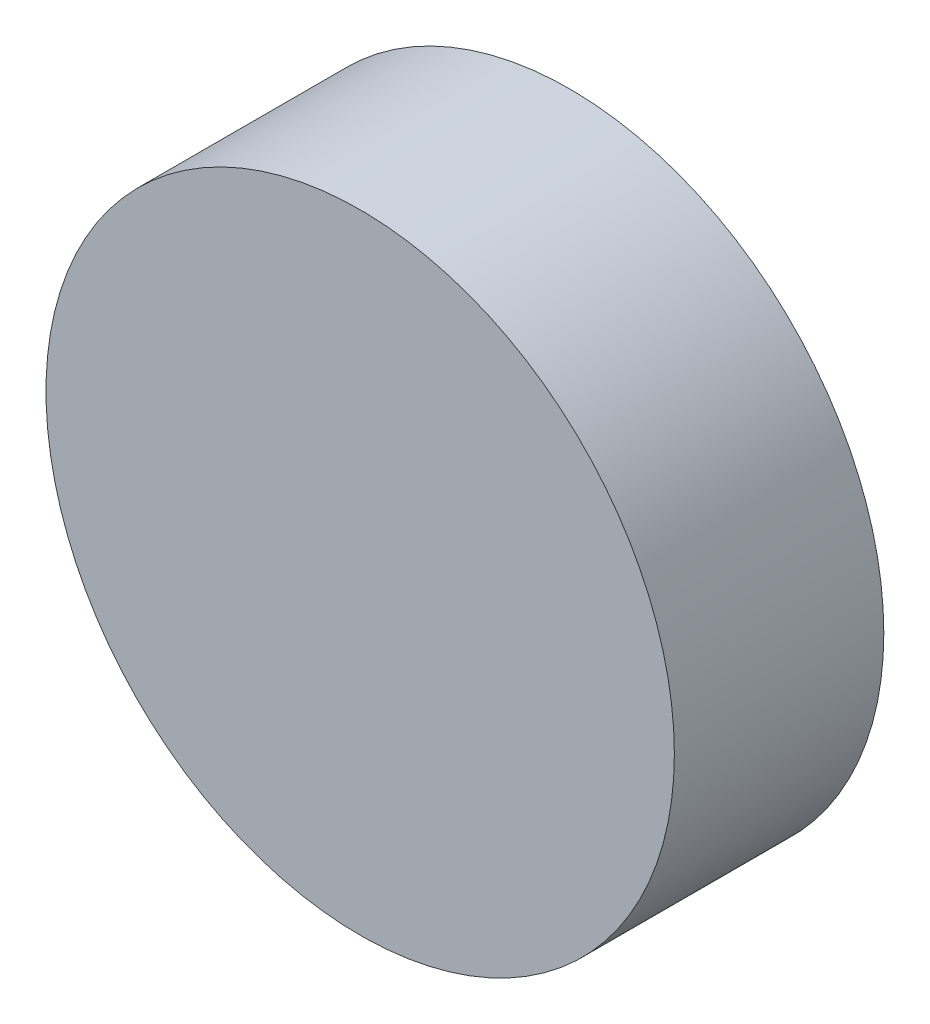
ISO-10303-21;
HEADER;
FILE_DESCRIPTION(('STEP AP214'),'2;1');
FILE_NAME('part.step','',(''),(''),'','','');
FILE_SCHEMA(('AUTOMOTIVE_DESIGN { 1 0 10303 214 1 1 1 1 }'));
ENDSEC;
DATA;
#1=APPLICATION_CONTEXT('core data for automotive mechanical design processes');
#2=APPLICATION_PROTOCOL_DEFINITION('international standard','automotive_design',2000,#1);
#3=PRODUCT_CONTEXT('',#1,'mechanical');
#4=PRODUCT('Part','Part','',(#3));
#5=PRODUCT_RELATED_PRODUCT_CATEGORY('part','',(#4));
#6=PRODUCT_DEFINITION_FORMATION('','',#4);
#7=PRODUCT_DEFINITION_CONTEXT('part definition',#1,'design');
#8=PRODUCT_DEFINITION('design','',#6,#7);
#9=PRODUCT_DEFINITION_SHAPE('','',#8);
#10=(LENGTH_UNIT() NAMED_UNIT(*) SI_UNIT(.MILLI.,.METRE.));
#11=(NAMED_UNIT(*) PLANE_ANGLE_UNIT() SI_UNIT($,.RADIAN.));
#12=(NAMED_UNIT(*) SI_UNIT($,.STERADIAN.) SOLID_ANGLE_UNIT());
#13=UNCERTAINTY_MEASURE_WITH_UNIT(LENGTH_MEASURE(1.E-05),#10,'distance_accuracy_value','');
#14=(GEOMETRIC_REPRESENTATION_CONTEXT(3) GLOBAL_UNCERTAINTY_ASSIGNED_CONTEXT((#13)) GLOBAL_UNIT_ASSIGNED_CONTEXT((#10,
#11,#12)) REPRESENTATION_CONTEXT('',''));
#15=CARTESIAN_POINT('',(0.,0.,0.));
#16=DIRECTION('',(0.,0.,1.));
#17=DIRECTION('',(1.,0.,0.));
#18=AXIS2_PLACEMENT_3D('',#15,#16,#17);
#19=CARTESIAN_POINT('',(0.,0.,2.));
#20=DIRECTION('',(0.,0.,-1.));
#21=DIRECTION('',(-1.,0.,0.));
#22=AXIS2_PLACEMENT_3D('',#19,#20,#21);
#23=CYLINDRICAL_SURFACE('',#22,3.);
#24=CARTESIAN_POINT('',(0.,0.,2.));
#25=DIRECTION('',(0.,0.,1.));
#26=DIRECTION('',(1.,0.,0.));
#27=AXIS2_PLACEMENT_3D('',#24,#25,#26);
#28=CIRCLE('',#27,3.);
#29=CARTESIAN_POINT('',(3.,0.,2.));
#30=VERTEX_POINT('',#29);
#31=EDGE_CURVE('E10',#30,#30,#28,.T.);
#32=ORIENTED_EDGE('',*,*,#31,.F.);
#33=EDGE_LOOP('',(#32));
#34=FACE_BOUND('',#33,.T.);
#35=CARTESIAN_POINT('',(0.,0.,0.));
#36=DIRECTION('',(0.,0.,1.));
#37=DIRECTION('',(1.,0.,0.));
#38=AXIS2_PLACEMENT_3D('',#35,#36,#37);
#39=CIRCLE('',#38,3.);
#40=CARTESIAN_POINT('',(3.,0.,0.));
#41=VERTEX_POINT('',#40);
#42=EDGE_CURVE('E34',#41,#41,#39,.T.);
#43=ORIENTED_EDGE('',*,*,#42,.T.);
#44=EDGE_LOOP('',(#43));
#45=FACE_BOUND('',#44,.T.);
#46=ADVANCED_FACE('F31',(#34,#45),#23,.T.);
#47=CARTESIAN_POINT('',(0.,0.,2.));
#48=DIRECTION('',(0.,0.,1.));
#49=DIRECTION('',(1.,0.,0.));
#50=AXIS2_PLACEMENT_3D('',#47,#48,#49);
#51=PLANE('',#50);
#52=ORIENTED_EDGE('',*,*,#31,.T.);
#53=EDGE_LOOP('',(#52));
#54=FACE_BOUND('',#53,.T.);
#55=ADVANCED_FACE('F46',(#54),#51,.T.);
#56=CARTESIAN_POINT('',(0.,0.,0.));
#57=DIRECTION('',(0.,0.,1.));
#58=DIRECTION('',(1.,0.,0.));
#59=AXIS2_PLACEMENT_3D('',#56,#57,#58);
#60=PLANE('',#59);
#61=ORIENTED_EDGE('',*,*,#42,.F.);
#62=EDGE_LOOP('',(#61));
#63=FACE_BOUND('',#62,.T.);
#64=ADVANCED_FACE('F44',(#63),#60,.F.);
#65=CLOSED_SHELL('',(#46,#55,#64));
#66=MANIFOLD_SOLID_BREP('B2',#65);
#67=ADVANCED_BREP_SHAPE_REPRESENTATION('',(#18,#66),#14);
#68=SHAPE_DEFINITION_REPRESENTATION(#9,#67);
ENDSEC;
END-ISO-10303-21;
